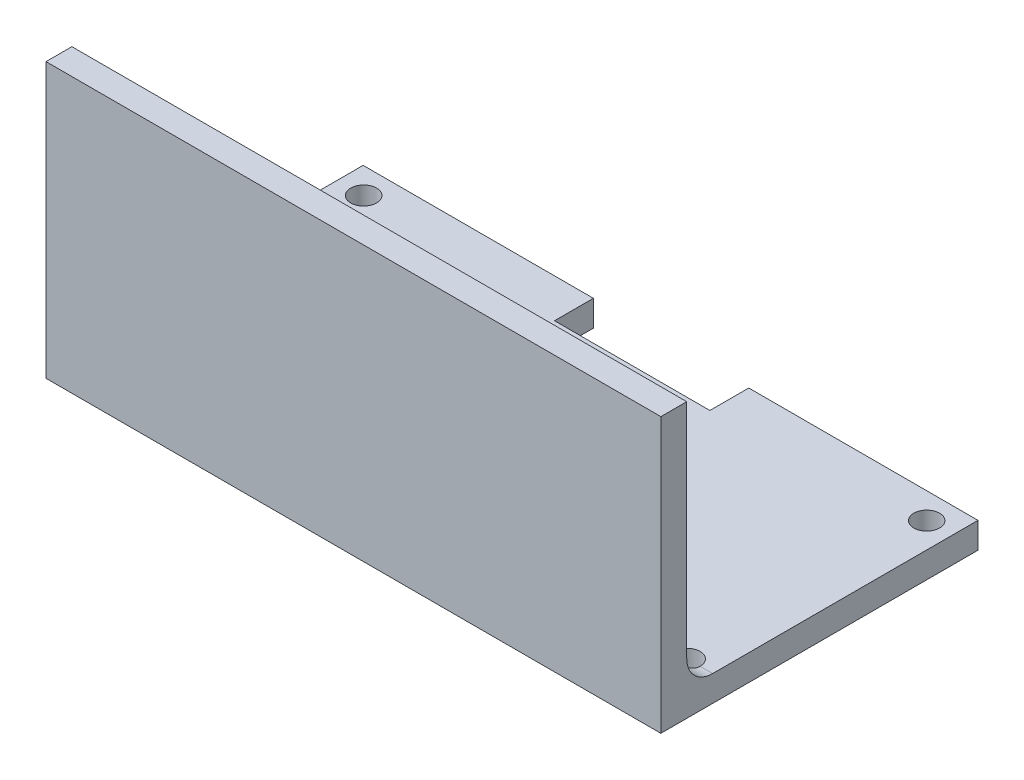
ISO-10303-21;
HEADER;
FILE_DESCRIPTION(('STEP AP214'),'2;1');
FILE_NAME('part.step','',(''),(''),'','','');
FILE_SCHEMA(('AUTOMOTIVE_DESIGN { 1 0 10303 214 1 1 1 1 }'));
ENDSEC;
DATA;
#1=APPLICATION_CONTEXT('core data for automotive mechanical design processes');
#2=APPLICATION_PROTOCOL_DEFINITION('international standard','automotive_design',2000,#1);
#3=PRODUCT_CONTEXT('',#1,'mechanical');
#4=PRODUCT('Part','Part','',(#3));
#5=PRODUCT_RELATED_PRODUCT_CATEGORY('part','',(#4));
#6=PRODUCT_DEFINITION_FORMATION('','',#4);
#7=PRODUCT_DEFINITION_CONTEXT('part definition',#1,'design');
#8=PRODUCT_DEFINITION('design','',#6,#7);
#9=PRODUCT_DEFINITION_SHAPE('','',#8);
#10=(LENGTH_UNIT() NAMED_UNIT(*) SI_UNIT(.MILLI.,.METRE.));
#11=(NAMED_UNIT(*) PLANE_ANGLE_UNIT() SI_UNIT($,.RADIAN.));
#12=(NAMED_UNIT(*) SI_UNIT($,.STERADIAN.) SOLID_ANGLE_UNIT());
#13=UNCERTAINTY_MEASURE_WITH_UNIT(LENGTH_MEASURE(1.E-05),#10,'distance_accuracy_value','');
#14=(GEOMETRIC_REPRESENTATION_CONTEXT(3) GLOBAL_UNCERTAINTY_ASSIGNED_CONTEXT((#13)) GLOBAL_UNIT_ASSIGNED_CONTEXT((#10,
#11,#12)) REPRESENTATION_CONTEXT('',''));
#15=CARTESIAN_POINT('',(0.,0.,0.));
#16=DIRECTION('',(0.,0.,1.));
#17=DIRECTION('',(1.,0.,0.));
#18=AXIS2_PLACEMENT_3D('',#15,#16,#17);
#19=CARTESIAN_POINT('',(-79.8619125241838,4.,13.7648006214418));
#20=DIRECTION('',(-1.,0.,0.));
#21=DIRECTION('',(0.,0.,1.));
#22=AXIS2_PLACEMENT_3D('',#19,#20,#21);
#23=CYLINDRICAL_SURFACE('',#22,2.);
#24=CARTESIAN_POINT('',(-78.82638927389,2.,13.7648006214418));
#25=CARTESIAN_POINT('',(-78.8263906766208,1.99999730053258,13.7912058140592));
#26=CARTESIAN_POINT('',(-78.8253427056016,2.0005235028447,13.8175969699913));
#27=CARTESIAN_POINT('',(-78.8211724394585,2.00260451764343,13.8701636253248));
#28=CARTESIAN_POINT('',(-78.8180509773506,2.00415891705531,13.8963392070586));
#29=CARTESIAN_POINT('',(-78.8056563572098,2.01029917596668,13.9740133699935));
#30=CARTESIAN_POINT('',(-78.7933523448074,2.01636274894786,14.024947526913));
#31=CARTESIAN_POINT('',(-78.7612040463394,2.03183273152503,14.1237183518671));
#32=CARTESIAN_POINT('',(-78.7413683839909,2.04123531716701,14.171558489499));
#33=CARTESIAN_POINT('',(-78.6948475994431,2.06252943652307,14.2632228012039));
#34=CARTESIAN_POINT('',(-78.6681556318775,2.07442345549281,14.307042901968));
#35=CARTESIAN_POINT('',(-78.6068703531311,2.10043809824125,14.392311623266));
#36=CARTESIAN_POINT('',(-78.5718991466863,2.11464948379914,14.433460355679));
#37=CARTESIAN_POINT('',(-78.4958635338584,2.14340181229798,14.509583460166));
#38=CARTESIAN_POINT('',(-78.4547951548608,2.15794296482571,14.5445537739106));
#39=CARTESIAN_POINT('',(-78.3639053566972,2.18701066761455,14.6100531005108));
#40=CARTESIAN_POINT('',(-78.3136519607212,2.20144847860652,14.6400266996228));
#41=CARTESIAN_POINT('',(-78.2080205989252,2.2271404855704,14.690969337651));
#42=CARTESIAN_POINT('',(-78.152646453432,2.23839702989233,14.7119450246079));
#43=CARTESIAN_POINT('',(-78.0417248386097,2.2554212269616,14.7429328811609));
#44=CARTESIAN_POINT('',(-77.9863862026021,2.26147713470105,14.7535262166481));
#45=CARTESIAN_POINT('',(-77.8744118490051,2.26818108241966,14.7652275843675));
#46=CARTESIAN_POINT('',(-77.8177774339023,2.26883433254572,14.7663447551307));
#47=CARTESIAN_POINT('',(-77.7121024438092,2.26489066751361,14.7594878564733));
#48=CARTESIAN_POINT('',(-77.6629636423443,2.26091223299037,14.7525849547301));
#49=CARTESIAN_POINT('',(-77.5666658271934,2.24923746262066,14.7317400175106));
#50=CARTESIAN_POINT('',(-77.5195073840757,2.24154006316962,14.7177959682512));
#51=CARTESIAN_POINT('',(-77.4271618435397,2.22312557536121,14.6830110395888));
#52=CARTESIAN_POINT('',(-77.3820461649969,2.21234238073419,14.6620172070066));
#53=CARTESIAN_POINT('',(-77.2957579843169,2.1889668748218,14.6138443042864));
#54=CARTESIAN_POINT('',(-77.2545875553031,2.17637362099291,14.5866620073253));
#55=CARTESIAN_POINT('',(-77.171865632664,2.14886762944909,14.5228647788188));
#56=CARTESIAN_POINT('',(-77.130927942316,2.13386327367781,14.4854907887354));
#57=CARTESIAN_POINT('',(-77.0556500953307,2.10452218677047,14.4043516332432));
#58=CARTESIAN_POINT('',(-77.0213123697157,2.09018570310504,14.360584123261));
#59=CARTESIAN_POINT('',(-76.9586957898924,2.06297676271028,14.265304333547));
#60=CARTESIAN_POINT('',(-76.9307752512297,2.05020408738087,14.213525636129));
#61=CARTESIAN_POINT('',(-76.8842828206029,2.02841649309686,14.1052419163897));
#62=CARTESIAN_POINT('',(-76.865698939806,2.01939675771243,14.0487430643793));
#63=CARTESIAN_POINT('',(-76.8399477212201,2.00677364049407,13.9376995485974));
#64=CARTESIAN_POINT('',(-76.8319437673522,2.00277481120003,13.8833974265881));
#65=CARTESIAN_POINT('',(-76.8266760283597,2.00014341769563,13.8013284802208));
#66=CARTESIAN_POINT('',(-76.8260511374659,1.99983142136346,13.7737895907992));
#67=CARTESIAN_POINT('',(-76.8270707499698,2.00034023724626,13.7187543875949));
#68=CARTESIAN_POINT('',(-76.8287160685828,2.00116145639049,13.6912580926578));
#69=CARTESIAN_POINT('',(-76.8314936218826,2.00254728256629,13.663891545454));
#70=B_SPLINE_CURVE_WITH_KNOTS('',3,(#24,#25,#26,#27,#28,#29,#30,#31,#32,#33,#34,#35,#36,#37,#38,
#39,#40,#41,#42,#43,#44,#45,#46,#47,#48,#49,#50,#51,#52,#53,#54,#55,#56,#57,#58,#59,#60,#61,#62,
#63,#64,#65,#66,#67,#68,#69),.UNSPECIFIED.,.F.,.F.,(4,2,2,2,2,2,2,2,2,2,2,2,2,2,2,2,2,2,2,2,2,2,
4),(0.,0.0791624081102156,0.158293032290819,0.315701742307837,0.47293076066649,
0.630317371509655,0.797144021461813,0.96407984830509,1.14397304071197,1.32373309047992,
1.49273163528559,1.66156718437676,1.8102131484956,1.95890164977203,2.11105047862747,
2.26327882419852,2.43481236034565,2.60640895835693,2.78602799466294,2.96541579599488,
3.12954523836756,3.21208521527715,3.29465483939361),.UNSPECIFIED.);
#71=CARTESIAN_POINT('',(-78.82638927389,2.,13.7648006214418));
#72=VERTEX_POINT('',#71);
#73=CARTESIAN_POINT('',(-76.82638927389,2.,13.7648006214418));
#74=VERTEX_POINT('',#73);
#75=EDGE_CURVE('E299',#72,#74,#70,.T.);
#76=ORIENTED_EDGE('',*,*,#75,.F.);
#77=DIRECTION('',(-1.,0.,0.));
#78=VECTOR('',#77,1.);
#79=CARTESIAN_POINT('',(0.,2.,13.7648006214418));
#80=LINE('',#79,#78);
#81=CARTESIAN_POINT('',(-79.8619125241838,2.,13.7648006214417));
#82=VERTEX_POINT('',#81);
#83=EDGE_CURVE('E288',#82,#72,#80,.F.);
#84=ORIENTED_EDGE('',*,*,#83,.F.);
#85=CARTESIAN_POINT('',(-79.8619125241838,4.,13.7648006214418));
#86=DIRECTION('',(1.,0.,0.));
#87=DIRECTION('',(0.,0.,-1.));
#88=AXIS2_PLACEMENT_3D('',#85,#86,#87);
#89=CIRCLE('',#88,2.);
#90=CARTESIAN_POINT('',(-79.8619125241838,4.,15.7648006214418));
#91=VERTEX_POINT('',#90);
#92=EDGE_CURVE('E12',#82,#91,#89,.F.);
#93=ORIENTED_EDGE('',*,*,#92,.T.);
#94=DIRECTION('',(-1.,0.,0.));
#95=VECTOR('',#94,1.);
#96=CARTESIAN_POINT('',(-79.8619125241838,4.,15.7648006214418));
#97=LINE('',#96,#95);
#98=CARTESIAN_POINT('',(-32.3619125241838,4.,15.7648006214418));
#99=VERTEX_POINT('',#98);
#100=EDGE_CURVE('E277',#99,#91,#97,.T.);
#101=ORIENTED_EDGE('',*,*,#100,.F.);
#102=CARTESIAN_POINT('',(-32.3619125241838,4.,13.7648006214418));
#103=DIRECTION('',(-1.,0.,0.));
#104=DIRECTION('',(0.,0.,1.));
#105=AXIS2_PLACEMENT_3D('',#102,#103,#104);
#106=CIRCLE('',#105,2.);
#107=CARTESIAN_POINT('',(-32.3619125241838,2.,13.7648006214417));
#108=VERTEX_POINT('',#107);
#109=EDGE_CURVE('E60',#99,#108,#106,.F.);
#110=ORIENTED_EDGE('',*,*,#109,.T.);
#111=DIRECTION('',(-1.,0.,0.));
#112=VECTOR('',#111,1.);
#113=CARTESIAN_POINT('',(0.,2.,13.7648006214418));
#114=LINE('',#113,#112);
#115=CARTESIAN_POINT('',(-33.3287681279813,2.,13.7648006214418));
#116=VERTEX_POINT('',#115);
#117=EDGE_CURVE('E281',#116,#108,#114,.F.);
#118=ORIENTED_EDGE('',*,*,#117,.F.);
#119=CARTESIAN_POINT('',(-35.3240104197987,2.,13.7648006214418));
#120=CARTESIAN_POINT('',(-35.3240196562883,1.99999731098801,13.7911498033239));
#121=CARTESIAN_POINT('',(-35.3229814832767,2.0005212847948,13.8174852985002));
#122=CARTESIAN_POINT('',(-35.3188345838743,2.00259355385925,13.8699418242963));
#123=CARTESIAN_POINT('',(-35.3157266859103,2.00414143928497,13.8960629364919));
#124=CARTESIAN_POINT('',(-35.3033779184535,2.01025614979094,13.973577257629));
#125=CARTESIAN_POINT('',(-35.2911114442099,2.01629467610362,14.0244083284571));
#126=CARTESIAN_POINT('',(-35.2590499504173,2.03170126568765,14.1229824481852));
#127=CARTESIAN_POINT('',(-35.2392634926173,2.04106554169188,14.1707289369204));
#128=CARTESIAN_POINT('',(-35.1928507936652,2.06227294834341,14.2622155907892));
#129=CARTESIAN_POINT('',(-35.1662177389438,2.07411854615575,14.3059517057298));
#130=CARTESIAN_POINT('',(-35.1050684507836,2.10002390128953,14.3910486918202));
#131=CARTESIAN_POINT('',(-35.0701761990366,2.11417367871529,14.4321113720076));
#132=CARTESIAN_POINT('',(-34.994309275873,2.14279957544208,14.5080751357615));
#133=CARTESIAN_POINT('',(-34.9533306596424,2.15727590119222,14.5429721907816));
#134=CARTESIAN_POINT('',(-34.8626549951643,2.18620623886221,14.6083208505207));
#135=CARTESIAN_POINT('',(-34.8125290060411,2.20057215336619,14.6382208578906));
#136=CARTESIAN_POINT('',(-34.7071686068573,2.22613501445059,14.6890395093967));
#137=CARTESIAN_POINT('',(-34.6519379845143,2.23733428607512,14.7099647489417));
#138=CARTESIAN_POINT('',(-34.5412957375564,2.25427493153567,14.7408847221932));
#139=CARTESIAN_POINT('',(-34.4860914932412,2.26030206089156,14.751457088464));
#140=CARTESIAN_POINT('',(-34.3743896906708,2.26697697898719,14.7631401551255));
#141=CARTESIAN_POINT('',(-34.3178934229281,2.26762991887759,14.7642599158475));
#142=CARTESIAN_POINT('',(-34.2124413586908,2.26371134228409,14.75742781465));
#143=CARTESIAN_POINT('',(-34.1633883204684,2.25975231617949,14.7505396646685));
#144=CARTESIAN_POINT('',(-34.0672576082118,2.24812981219803,14.729731405709));
#145=CARTESIAN_POINT('',(-34.0201804985535,2.24046528365539,14.7158093022589));
#146=CARTESIAN_POINT('',(-33.9280012752951,2.22212809195747,14.6810772520038));
#147=CARTESIAN_POINT('',(-33.8829700109676,2.21138996296584,14.6601154654723));
#148=CARTESIAN_POINT('',(-33.7968452945497,2.18811063201937,14.6120138356231));
#149=CARTESIAN_POINT('',(-33.7557539103798,2.17556849173604,14.5848707728985));
#150=CARTESIAN_POINT('',(-33.6732191218999,2.14818152231985,14.5211829457221));
#151=CARTESIAN_POINT('',(-33.6323858114118,2.13324585232924,14.4838839586861));
#152=CARTESIAN_POINT('',(-33.5573044250291,2.10403922414746,14.4029116010195));
#153=CARTESIAN_POINT('',(-33.5230587550126,2.08976851024188,14.3592359117518));
#154=CARTESIAN_POINT('',(-33.460622286126,2.06268762719189,14.2641709950128));
#155=CARTESIAN_POINT('',(-33.4327874891417,2.04997635172959,14.2125173667377));
#156=CARTESIAN_POINT('',(-33.3864426364069,2.02829281139565,14.1045019728133));
#157=CARTESIAN_POINT('',(-33.3679206944024,2.01931578294281,14.0481463162162));
#158=CARTESIAN_POINT('',(-33.3422560436927,2.00674818239498,13.9373691669836));
#159=CARTESIAN_POINT('',(-33.3342823383118,2.00276575427113,13.8831882008116));
#160=CARTESIAN_POINT('',(-33.3290455765029,2.00014384911874,13.8013048044284));
#161=CARTESIAN_POINT('',(-33.3284285866999,1.99983246297584,13.7738288545231));
#162=CARTESIAN_POINT('',(-33.3294590045538,2.00033730332387,13.7189199392845));
#163=CARTESIAN_POINT('',(-33.3311072221108,2.00115393312511,13.691486992838));
#164=CARTESIAN_POINT('',(-33.3338851581858,2.00253254766109,13.6641836405354));
#165=B_SPLINE_CURVE_WITH_KNOTS('',3,(#119,#120,#121,#122,#123,#124,#125,#126,#127,#128,#129,
#130,#131,#132,#133,#134,#135,#136,#137,#138,#139,#140,#141,#142,#143,#144,#145,#146,#147,#148,
#149,#150,#151,#152,#153,#154,#155,#156,#157,#158,#159,#160,#161,#162,#163,#164),.UNSPECIFIED.,
.F.,.F.,(4,2,2,2,2,2,2,2,2,2,2,2,2,2,2,2,2,2,2,2,2,2,4),(0.,0.0789945175294009,
0.157957435746329,0.31503451922661,0.471933298431202,0.628988828113019,0.795431100601996,
0.96198172552628,1.1413973018828,1.32068080183299,1.48926828819443,1.65769416492153,
1.80607648672024,1.95450090584395,2.10635772075132,2.25829380918555,2.429405434441,
2.60057943337982,2.7797204820243,2.95863230388982,3.12238912881203,3.20474011546546,
3.28712055347572),.UNSPECIFIED.);
#166=CARTESIAN_POINT('',(-35.3240104197987,2.,13.7648006214418));
#167=VERTEX_POINT('',#166);
#168=EDGE_CURVE('E67',#167,#116,#165,.T.);
#169=ORIENTED_EDGE('',*,*,#168,.F.);
#170=DIRECTION('',(-1.,0.,0.));
#171=VECTOR('',#170,1.);
#172=CARTESIAN_POINT('',(0.,2.,13.7648006214418));
#173=LINE('',#172,#171);
#174=EDGE_CURVE('E285',#74,#167,#173,.F.);
#175=ORIENTED_EDGE('',*,*,#174,.F.);
#176=EDGE_LOOP('',(#76,#84,#93,#101,#110,#118,#169,#175));
#177=FACE_BOUND('',#176,.T.);
#178=ADVANCED_FACE('F51',(#177),#23,.F.);
#179=CARTESIAN_POINT('',(-79.8619125241838,2.,-6.73519937855824));
#180=DIRECTION('',(0.,0.,1.));
#181=DIRECTION('',(1.,0.,0.));
#182=AXIS2_PLACEMENT_3D('',#179,#180,#181);
#183=PLANE('',#182);
#184=DIRECTION('',(0.,1.,0.));
#185=VECTOR('',#184,1.);
#186=CARTESIAN_POINT('',(-50.0697466994081,-8.,-6.73519937855824));
#187=LINE('',#186,#185);
#188=CARTESIAN_POINT('',(-50.0697466994081,0.,-6.73519937855824));
#189=VERTEX_POINT('',#188);
#190=CARTESIAN_POINT('',(-50.0697466994081,2.,-6.73519937855824));
#191=VERTEX_POINT('',#190);
#192=EDGE_CURVE('E201',#189,#191,#187,.T.);
#193=ORIENTED_EDGE('',*,*,#192,.T.);
#194=DIRECTION('',(-1.,0.,0.));
#195=VECTOR('',#194,1.);
#196=CARTESIAN_POINT('',(-79.8619125241838,2.,-6.73519937855824));
#197=LINE('',#196,#195);
#198=CARTESIAN_POINT('',(-32.3619125241838,2.,-6.73519937855824));
#199=VERTEX_POINT('',#198);
#200=EDGE_CURVE('E246',#199,#191,#197,.T.);
#201=ORIENTED_EDGE('',*,*,#200,.F.);
#202=DIRECTION('',(0.,-1.,0.));
#203=VECTOR('',#202,1.);
#204=CARTESIAN_POINT('',(-32.3619125241838,2.,-6.73519937855824));
#205=LINE('',#204,#203);
#206=CARTESIAN_POINT('',(-32.3619125241838,0.,-6.73519937855824));
#207=VERTEX_POINT('',#206);
#208=EDGE_CURVE('E262',#199,#207,#205,.T.);
#209=ORIENTED_EDGE('',*,*,#208,.T.);
#210=DIRECTION('',(-1.,0.,0.));
#211=VECTOR('',#210,1.);
#212=CARTESIAN_POINT('',(-79.8619125241838,0.,-6.73519937855824));
#213=LINE('',#212,#211);
#214=EDGE_CURVE('E242',#207,#189,#213,.T.);
#215=ORIENTED_EDGE('',*,*,#214,.T.);
#216=EDGE_LOOP('',(#193,#201,#209,#215));
#217=FACE_BOUND('',#216,.T.);
#218=ADVANCED_FACE('F325',(#217),#183,.F.);
#219=CARTESIAN_POINT('',(-79.8619125241838,2.,-6.73519937855824));
#220=DIRECTION('',(1.,0.,0.));
#221=DIRECTION('',(0.,0.,-1.));
#222=AXIS2_PLACEMENT_3D('',#219,#220,#221);
#223=PLANE('',#222);
#224=DIRECTION('',(0.,0.,1.));
#225=VECTOR('',#224,1.);
#226=CARTESIAN_POINT('',(-79.8619125241838,0.,-6.73519937855824));
#227=LINE('',#226,#225);
#228=CARTESIAN_POINT('',(-79.8619125241838,0.,-6.73519937855824));
#229=VERTEX_POINT('',#228);
#230=CARTESIAN_POINT('',(-79.8619125241838,0.,17.7648006214418));
#231=VERTEX_POINT('',#230);
#232=EDGE_CURVE('E172',#229,#231,#227,.T.);
#233=ORIENTED_EDGE('',*,*,#232,.T.);
#234=DIRECTION('',(0.,-1.,0.));
#235=VECTOR('',#234,1.);
#236=CARTESIAN_POINT('',(-79.8619125241838,21.1900753357362,17.7648006214418));
#237=LINE('',#236,#235);
#238=CARTESIAN_POINT('',(-79.8619125241838,21.1900753357362,17.7648006214418));
#239=VERTEX_POINT('',#238);
#240=EDGE_CURVE('E150',#239,#231,#237,.T.);
#241=ORIENTED_EDGE('',*,*,#240,.F.);
#242=DIRECTION('',(0.,0.,1.));
#243=VECTOR('',#242,1.);
#244=CARTESIAN_POINT('',(-79.8619125241838,21.1900753357362,15.7648006214418));
#245=LINE('',#244,#243);
#246=CARTESIAN_POINT('',(-79.8619125241838,21.1900753357362,15.7648006214418));
#247=VERTEX_POINT('',#246);
#248=EDGE_CURVE('E157',#247,#239,#245,.T.);
#249=ORIENTED_EDGE('',*,*,#248,.F.);
#250=DIRECTION('',(0.,-1.,0.));
#251=VECTOR('',#250,1.);
#252=CARTESIAN_POINT('',(-79.8619125241838,21.1900753357362,15.7648006214418));
#253=LINE('',#252,#251);
#254=EDGE_CURVE('E381',#247,#91,#253,.T.);
#255=ORIENTED_EDGE('',*,*,#254,.T.);
#256=ORIENTED_EDGE('',*,*,#92,.F.);
#257=DIRECTION('',(0.,0.,1.));
#258=VECTOR('',#257,1.);
#259=CARTESIAN_POINT('',(-79.8619125241838,2.,-6.73519937855824));
#260=LINE('',#259,#258);
#261=CARTESIAN_POINT('',(-79.8619125241838,2.,-6.73519937855824));
#262=VERTEX_POINT('',#261);
#263=EDGE_CURVE('E237',#262,#82,#260,.T.);
#264=ORIENTED_EDGE('',*,*,#263,.F.);
#265=DIRECTION('',(0.,-1.,0.));
#266=VECTOR('',#265,1.);
#267=CARTESIAN_POINT('',(-79.8619125241838,2.,-6.73519937855824));
#268=LINE('',#267,#266);
#269=EDGE_CURVE('E250',#262,#229,#268,.T.);
#270=ORIENTED_EDGE('',*,*,#269,.T.);
#271=EDGE_LOOP('',(#233,#241,#249,#255,#256,#264,#270));
#272=FACE_BOUND('',#271,.T.);
#273=ADVANCED_FACE('F169',(#272),#223,.F.);
#274=CARTESIAN_POINT('',(-32.3619125241838,2.,-6.73519937855824));
#275=DIRECTION('',(-1.,0.,0.));
#276=DIRECTION('',(0.,0.,1.));
#277=AXIS2_PLACEMENT_3D('',#274,#275,#276);
#278=PLANE('',#277);
#279=DIRECTION('',(0.,0.,-1.));
#280=VECTOR('',#279,1.);
#281=CARTESIAN_POINT('',(-32.3619125241838,0.,-6.73519937855824));
#282=LINE('',#281,#280);
#283=CARTESIAN_POINT('',(-32.3619125241838,0.,17.7648006214418));
#284=VERTEX_POINT('',#283);
#285=EDGE_CURVE('E253',#284,#207,#282,.T.);
#286=ORIENTED_EDGE('',*,*,#285,.T.);
#287=ORIENTED_EDGE('',*,*,#208,.F.);
#288=DIRECTION('',(0.,0.,-1.));
#289=VECTOR('',#288,1.);
#290=CARTESIAN_POINT('',(-32.3619125241838,2.,-6.73519937855824));
#291=LINE('',#290,#289);
#292=EDGE_CURVE('E241',#108,#199,#291,.T.);
#293=ORIENTED_EDGE('',*,*,#292,.F.);
#294=ORIENTED_EDGE('',*,*,#109,.F.);
#295=DIRECTION('',(0.,-1.,0.));
#296=VECTOR('',#295,1.);
#297=CARTESIAN_POINT('',(-32.3619125241838,21.1900753357362,15.7648006214418));
#298=LINE('',#297,#296);
#299=CARTESIAN_POINT('',(-32.3619125241838,21.1900753357362,15.7648006214418));
#300=VERTEX_POINT('',#299);
#301=EDGE_CURVE('E182',#300,#99,#298,.T.);
#302=ORIENTED_EDGE('',*,*,#301,.F.);
#303=DIRECTION('',(0.,0.,-1.));
#304=VECTOR('',#303,1.);
#305=CARTESIAN_POINT('',(-32.3619125241838,21.1900753357362,15.7648006214418));
#306=LINE('',#305,#304);
#307=CARTESIAN_POINT('',(-32.3619125241838,21.1900753357362,17.7648006214418));
#308=VERTEX_POINT('',#307);
#309=EDGE_CURVE('E156',#308,#300,#306,.T.);
#310=ORIENTED_EDGE('',*,*,#309,.F.);
#311=DIRECTION('',(0.,-1.,0.));
#312=VECTOR('',#311,1.);
#313=CARTESIAN_POINT('',(-32.3619125241838,21.1900753357362,17.7648006214418));
#314=LINE('',#313,#312);
#315=EDGE_CURVE('E152',#308,#284,#314,.T.);
#316=ORIENTED_EDGE('',*,*,#315,.T.);
#317=EDGE_LOOP('',(#286,#287,#293,#294,#302,#310,#316));
#318=FACE_BOUND('',#317,.T.);
#319=ADVANCED_FACE('F323',(#318),#278,.F.);
#320=CARTESIAN_POINT('',(-62.0739323200493,2.,-6.73519937855824));
#321=VERTEX_POINT('',#320);
#322=EDGE_CURVE('E245',#321,#262,#197,.T.);
#323=ORIENTED_EDGE('',*,*,#322,.F.);
#324=DIRECTION('',(0.,1.,0.));
#325=VECTOR('',#324,1.);
#326=CARTESIAN_POINT('',(-62.0739323200493,-8.,-6.73519937855824));
#327=LINE('',#326,#325);
#328=CARTESIAN_POINT('',(-62.0739323200493,0.,-6.73519937855824));
#329=VERTEX_POINT('',#328);
#330=EDGE_CURVE('E198',#329,#321,#327,.T.);
#331=ORIENTED_EDGE('',*,*,#330,.F.);
#332=EDGE_CURVE('E256',#329,#229,#213,.T.);
#333=ORIENTED_EDGE('',*,*,#332,.T.);
#334=ORIENTED_EDGE('',*,*,#269,.F.);
#335=EDGE_LOOP('',(#323,#331,#333,#334));
#336=FACE_BOUND('',#335,.T.);
#337=ADVANCED_FACE('F316',(#336),#183,.F.);
#338=CARTESIAN_POINT('',(0.,2.,0.));
#339=DIRECTION('',(0.,1.,0.));
#340=DIRECTION('',(0.,0.,1.));
#341=AXIS2_PLACEMENT_3D('',#338,#339,#340);
#342=PLANE('',#341);
#343=ORIENTED_EDGE('',*,*,#263,.T.);
#344=ORIENTED_EDGE('',*,*,#83,.T.);
#345=CARTESIAN_POINT('',(-77.82638927389,2.,13.7648006214418));
#346=DIRECTION('',(0.,1.,0.));
#347=DIRECTION('',(0.,0.,1.));
#348=AXIS2_PLACEMENT_3D('',#345,#346,#347);
#349=CIRCLE('',#348,0.999999999999998);
#350=EDGE_CURVE('E210',#74,#72,#349,.T.);
#351=ORIENTED_EDGE('',*,*,#350,.F.);
#352=ORIENTED_EDGE('',*,*,#174,.T.);
#353=CARTESIAN_POINT('',(-34.32638927389,2.,13.7650975605227));
#354=DIRECTION('',(0.,1.,0.));
#355=DIRECTION('',(0.,0.,1.));
#356=AXIS2_PLACEMENT_3D('',#353,#354,#355);
#357=CIRCLE('',#356,0.997621190100215);
#358=EDGE_CURVE('E234',#116,#167,#357,.T.);
#359=ORIENTED_EDGE('',*,*,#358,.F.);
#360=ORIENTED_EDGE('',*,*,#117,.T.);
#361=ORIENTED_EDGE('',*,*,#292,.T.);
#362=ORIENTED_EDGE('',*,*,#200,.T.);
#363=DIRECTION('',(0.,0.,1.));
#364=VECTOR('',#363,1.);
#365=CARTESIAN_POINT('',(-50.0697466994081,2.,-6.73519937855824));
#366=LINE('',#365,#364);
#367=CARTESIAN_POINT('',(-50.0697466994081,2.,-3.73031583067593));
#368=VERTEX_POINT('',#367);
#369=EDGE_CURVE('E180',#191,#368,#366,.T.);
#370=ORIENTED_EDGE('',*,*,#369,.T.);
#371=DIRECTION('',(1.,0.,0.));
#372=VECTOR('',#371,1.);
#373=CARTESIAN_POINT('',(-62.0739323200493,2.,-3.73031583067593));
#374=LINE('',#373,#372);
#375=CARTESIAN_POINT('',(-62.0739323200493,2.,-3.73031583067593));
#376=VERTEX_POINT('',#375);
#377=EDGE_CURVE('E175',#376,#368,#374,.T.);
#378=ORIENTED_EDGE('',*,*,#377,.F.);
#379=DIRECTION('',(0.,0.,1.));
#380=VECTOR('',#379,1.);
#381=CARTESIAN_POINT('',(-62.0739323200493,2.,-6.73519937855824));
#382=LINE('',#381,#380);
#383=EDGE_CURVE('E189',#321,#376,#382,.T.);
#384=ORIENTED_EDGE('',*,*,#383,.F.);
#385=ORIENTED_EDGE('',*,*,#322,.T.);
#386=EDGE_LOOP('',(#343,#344,#351,#352,#359,#360,#361,#362,#370,#378,#384,#385));
#387=FACE_BOUND('',#386,.T.);
#388=CARTESIAN_POINT('',(-77.8239323200494,2.,-4.73519937855824));
#389=DIRECTION('',(0.,1.,0.));
#390=DIRECTION('',(0.,0.,1.));
#391=AXIS2_PLACEMENT_3D('',#388,#389,#390);
#392=CIRCLE('',#391,0.999999999999998);
#393=CARTESIAN_POINT('',(-77.8239323200494,2.,-3.73519937855825));
#394=VERTEX_POINT('',#393);
#395=EDGE_CURVE('E218',#394,#394,#392,.T.);
#396=ORIENTED_EDGE('',*,*,#395,.F.);
#397=EDGE_LOOP('',(#396));
#398=FACE_BOUND('',#397,.T.);
#399=CARTESIAN_POINT('',(-34.3245158367701,2.,-4.73538954817592));
#400=DIRECTION('',(0.,1.,0.));
#401=DIRECTION('',(0.,0.,1.));
#402=AXIS2_PLACEMENT_3D('',#399,#400,#401);
#403=CIRCLE('',#402,0.995230862637965);
#404=CARTESIAN_POINT('',(-34.3245158367701,2.,-3.74015868553795));
#405=VERTEX_POINT('',#404);
#406=EDGE_CURVE('E226',#405,#405,#403,.T.);
#407=ORIENTED_EDGE('',*,*,#406,.F.);
#408=EDGE_LOOP('',(#407));
#409=FACE_BOUND('',#408,.T.);
#410=ADVANCED_FACE('F313',(#387,#398,#409),#342,.T.);
#411=CARTESIAN_POINT('',(0.,0.,0.));
#412=DIRECTION('',(0.,1.,0.));
#413=DIRECTION('',(0.,0.,1.));
#414=AXIS2_PLACEMENT_3D('',#411,#412,#413);
#415=PLANE('',#414);
#416=CARTESIAN_POINT('',(-77.82638927389,0.,13.7648006214418));
#417=DIRECTION('',(0.,-1.,0.));
#418=DIRECTION('',(0.,0.,-1.));
#419=AXIS2_PLACEMENT_3D('',#416,#417,#418);
#420=CIRCLE('',#419,0.999999999999998);
#421=CARTESIAN_POINT('',(-77.82638927389,0.,12.7648006214418));
#422=VERTEX_POINT('',#421);
#423=EDGE_CURVE('E197',#422,#422,#420,.T.);
#424=ORIENTED_EDGE('',*,*,#423,.F.);
#425=EDGE_LOOP('',(#424));
#426=FACE_BOUND('',#425,.T.);
#427=CARTESIAN_POINT('',(-77.8239323200494,0.,-4.73519937855824));
#428=DIRECTION('',(0.,-1.,0.));
#429=DIRECTION('',(0.,0.,-1.));
#430=AXIS2_PLACEMENT_3D('',#427,#428,#429);
#431=CIRCLE('',#430,0.999999999999998);
#432=CARTESIAN_POINT('',(-77.8239323200494,0.,-5.73519937855824));
#433=VERTEX_POINT('',#432);
#434=EDGE_CURVE('E214',#433,#433,#431,.T.);
#435=ORIENTED_EDGE('',*,*,#434,.F.);
#436=EDGE_LOOP('',(#435));
#437=FACE_BOUND('',#436,.T.);
#438=CARTESIAN_POINT('',(-34.3245158367701,0.,-4.73538954817592));
#439=DIRECTION('',(0.,-1.,0.));
#440=DIRECTION('',(0.,0.,-1.));
#441=AXIS2_PLACEMENT_3D('',#438,#439,#440);
#442=CIRCLE('',#441,0.995230862637965);
#443=CARTESIAN_POINT('',(-34.3245158367701,0.,-5.73062041081388));
#444=VERTEX_POINT('',#443);
#445=EDGE_CURVE('E222',#444,#444,#442,.T.);
#446=ORIENTED_EDGE('',*,*,#445,.F.);
#447=EDGE_LOOP('',(#446));
#448=FACE_BOUND('',#447,.T.);
#449=CARTESIAN_POINT('',(-34.32638927389,0.,13.7650975605227));
#450=DIRECTION('',(0.,-1.,0.));
#451=DIRECTION('',(0.,0.,-1.));
#452=AXIS2_PLACEMENT_3D('',#449,#450,#451);
#453=CIRCLE('',#452,0.997621190100215);
#454=CARTESIAN_POINT('',(-34.32638927389,0.,12.7674763704225));
#455=VERTEX_POINT('',#454);
#456=EDGE_CURVE('E230',#455,#455,#453,.T.);
#457=ORIENTED_EDGE('',*,*,#456,.F.);
#458=EDGE_LOOP('',(#457));
#459=FACE_BOUND('',#458,.T.);
#460=ORIENTED_EDGE('',*,*,#332,.F.);
#461=DIRECTION('',(0.,0.,1.));
#462=VECTOR('',#461,1.);
#463=CARTESIAN_POINT('',(-62.0739323200493,0.,0.));
#464=LINE('',#463,#462);
#465=CARTESIAN_POINT('',(-62.0739323200493,0.,-3.73031583067593));
#466=VERTEX_POINT('',#465);
#467=EDGE_CURVE('E273',#329,#466,#464,.T.);
#468=ORIENTED_EDGE('',*,*,#467,.T.);
#469=DIRECTION('',(1.,0.,0.));
#470=VECTOR('',#469,1.);
#471=CARTESIAN_POINT('',(0.,0.,-3.73031583067593));
#472=LINE('',#471,#470);
#473=CARTESIAN_POINT('',(-50.0697466994081,0.,-3.73031583067593));
#474=VERTEX_POINT('',#473);
#475=EDGE_CURVE('E269',#466,#474,#472,.T.);
#476=ORIENTED_EDGE('',*,*,#475,.T.);
#477=DIRECTION('',(0.,0.,1.));
#478=VECTOR('',#477,1.);
#479=CARTESIAN_POINT('',(-50.0697466994081,0.,0.));
#480=LINE('',#479,#478);
#481=EDGE_CURVE('E266',#189,#474,#480,.T.);
#482=ORIENTED_EDGE('',*,*,#481,.F.);
#483=ORIENTED_EDGE('',*,*,#214,.F.);
#484=ORIENTED_EDGE('',*,*,#285,.F.);
#485=DIRECTION('',(1.,0.,0.));
#486=VECTOR('',#485,1.);
#487=CARTESIAN_POINT('',(-79.8619125241838,0.,17.7648006214418));
#488=LINE('',#487,#486);
#489=EDGE_CURVE('E167',#231,#284,#488,.T.);
#490=ORIENTED_EDGE('',*,*,#489,.F.);
#491=ORIENTED_EDGE('',*,*,#232,.F.);
#492=EDGE_LOOP('',(#460,#468,#476,#482,#483,#484,#490,#491));
#493=FACE_BOUND('',#492,.T.);
#494=ADVANCED_FACE('F311',(#426,#437,#448,#459,#493),#415,.F.);
#495=CARTESIAN_POINT('',(-34.32638927389,10.,13.7650975605227));
#496=DIRECTION('',(0.,-1.,0.));
#497=DIRECTION('',(0.,0.,-1.));
#498=AXIS2_PLACEMENT_3D('',#495,#496,#497);
#499=CYLINDRICAL_SURFACE('',#498,0.997621190100215);
#500=ORIENTED_EDGE('',*,*,#358,.T.);
#501=ORIENTED_EDGE('',*,*,#168,.T.);
#502=EDGE_LOOP('',(#500,#501));
#503=FACE_BOUND('',#502,.T.);
#504=ORIENTED_EDGE('',*,*,#456,.T.);
#505=EDGE_LOOP('',(#504));
#506=FACE_BOUND('',#505,.T.);
#507=ADVANCED_FACE('F305',(#503,#506),#499,.F.);
#508=CARTESIAN_POINT('',(-34.3245158367701,10.,-4.73538954817592));
#509=DIRECTION('',(0.,-1.,0.));
#510=DIRECTION('',(0.,0.,-1.));
#511=AXIS2_PLACEMENT_3D('',#508,#509,#510);
#512=CYLINDRICAL_SURFACE('',#511,0.995230862637965);
#513=ORIENTED_EDGE('',*,*,#406,.T.);
#514=EDGE_LOOP('',(#513));
#515=FACE_BOUND('',#514,.T.);
#516=ORIENTED_EDGE('',*,*,#445,.T.);
#517=EDGE_LOOP('',(#516));
#518=FACE_BOUND('',#517,.T.);
#519=ADVANCED_FACE('F310',(#515,#518),#512,.F.);
#520=CARTESIAN_POINT('',(-77.8239323200494,10.,-4.73519937855824));
#521=DIRECTION('',(0.,-1.,0.));
#522=DIRECTION('',(0.,0.,-1.));
#523=AXIS2_PLACEMENT_3D('',#520,#521,#522);
#524=CYLINDRICAL_SURFACE('',#523,0.999999999999998);
#525=ORIENTED_EDGE('',*,*,#395,.T.);
#526=EDGE_LOOP('',(#525));
#527=FACE_BOUND('',#526,.T.);
#528=ORIENTED_EDGE('',*,*,#434,.T.);
#529=EDGE_LOOP('',(#528));
#530=FACE_BOUND('',#529,.T.);
#531=ADVANCED_FACE('F347',(#527,#530),#524,.F.);
#532=CARTESIAN_POINT('',(-77.82638927389,10.,13.7648006214418));
#533=DIRECTION('',(0.,-1.,0.));
#534=DIRECTION('',(0.,0.,-1.));
#535=AXIS2_PLACEMENT_3D('',#532,#533,#534);
#536=CYLINDRICAL_SURFACE('',#535,0.999999999999998);
#537=ORIENTED_EDGE('',*,*,#350,.T.);
#538=ORIENTED_EDGE('',*,*,#75,.T.);
#539=EDGE_LOOP('',(#537,#538));
#540=FACE_BOUND('',#539,.T.);
#541=ORIENTED_EDGE('',*,*,#423,.T.);
#542=EDGE_LOOP('',(#541));
#543=FACE_BOUND('',#542,.T.);
#544=ADVANCED_FACE('F343',(#540,#543),#536,.F.);
#545=CARTESIAN_POINT('',(-62.0739323200493,-8.,-3.73031583067593));
#546=DIRECTION('',(0.,0.,1.));
#547=DIRECTION('',(1.,0.,0.));
#548=AXIS2_PLACEMENT_3D('',#545,#546,#547);
#549=PLANE('',#548);
#550=DIRECTION('',(0.,1.,0.));
#551=VECTOR('',#550,1.);
#552=CARTESIAN_POINT('',(-62.0739323200493,-8.,-3.73031583067593));
#553=LINE('',#552,#551);
#554=EDGE_CURVE('E194',#466,#376,#553,.T.);
#555=ORIENTED_EDGE('',*,*,#554,.T.);
#556=ORIENTED_EDGE('',*,*,#377,.T.);
#557=DIRECTION('',(0.,1.,0.));
#558=VECTOR('',#557,1.);
#559=CARTESIAN_POINT('',(-50.0697466994081,-8.,-3.73031583067593));
#560=LINE('',#559,#558);
#561=EDGE_CURVE('E193',#474,#368,#560,.T.);
#562=ORIENTED_EDGE('',*,*,#561,.F.);
#563=ORIENTED_EDGE('',*,*,#475,.F.);
#564=EDGE_LOOP('',(#555,#556,#562,#563));
#565=FACE_BOUND('',#564,.T.);
#566=ADVANCED_FACE('F346',(#565),#549,.F.);
#567=CARTESIAN_POINT('',(-62.0739323200493,-8.,-6.73519937855824));
#568=DIRECTION('',(-1.,0.,0.));
#569=DIRECTION('',(0.,0.,1.));
#570=AXIS2_PLACEMENT_3D('',#567,#568,#569);
#571=PLANE('',#570);
#572=ORIENTED_EDGE('',*,*,#330,.T.);
#573=ORIENTED_EDGE('',*,*,#383,.T.);
#574=ORIENTED_EDGE('',*,*,#554,.F.);
#575=ORIENTED_EDGE('',*,*,#467,.F.);
#576=EDGE_LOOP('',(#572,#573,#574,#575));
#577=FACE_BOUND('',#576,.T.);
#578=ADVANCED_FACE('F379',(#577),#571,.F.);
#579=CARTESIAN_POINT('',(-50.0697466994081,-8.,-6.73519937855824));
#580=DIRECTION('',(-1.,0.,0.));
#581=DIRECTION('',(0.,0.,1.));
#582=AXIS2_PLACEMENT_3D('',#579,#580,#581);
#583=PLANE('',#582);
#584=ORIENTED_EDGE('',*,*,#481,.T.);
#585=ORIENTED_EDGE('',*,*,#561,.T.);
#586=ORIENTED_EDGE('',*,*,#369,.F.);
#587=ORIENTED_EDGE('',*,*,#192,.F.);
#588=EDGE_LOOP('',(#584,#585,#586,#587));
#589=FACE_BOUND('',#588,.T.);
#590=ADVANCED_FACE('F373',(#589),#583,.T.);
#591=CARTESIAN_POINT('',(-79.8619125241838,21.1900753357362,17.7648006214418));
#592=DIRECTION('',(0.,0.,-1.));
#593=DIRECTION('',(-1.,0.,0.));
#594=AXIS2_PLACEMENT_3D('',#591,#592,#593);
#595=PLANE('',#594);
#596=ORIENTED_EDGE('',*,*,#489,.T.);
#597=ORIENTED_EDGE('',*,*,#315,.F.);
#598=DIRECTION('',(1.,0.,0.));
#599=VECTOR('',#598,1.);
#600=CARTESIAN_POINT('',(-79.8619125241838,21.1900753357362,17.7648006214418));
#601=LINE('',#600,#599);
#602=EDGE_CURVE('E145',#239,#308,#601,.T.);
#603=ORIENTED_EDGE('',*,*,#602,.F.);
#604=ORIENTED_EDGE('',*,*,#240,.T.);
#605=EDGE_LOOP('',(#596,#597,#603,#604));
#606=FACE_BOUND('',#605,.T.);
#607=ADVANCED_FACE('F148',(#606),#595,.F.);
#608=CARTESIAN_POINT('',(-79.8619125241838,21.1900753357362,15.7648006214418));
#609=DIRECTION('',(0.,0.,1.));
#610=DIRECTION('',(1.,0.,0.));
#611=AXIS2_PLACEMENT_3D('',#608,#609,#610);
#612=PLANE('',#611);
#613=ORIENTED_EDGE('',*,*,#301,.T.);
#614=ORIENTED_EDGE('',*,*,#100,.T.);
#615=ORIENTED_EDGE('',*,*,#254,.F.);
#616=DIRECTION('',(-1.,0.,0.));
#617=VECTOR('',#616,1.);
#618=CARTESIAN_POINT('',(-79.8619125241838,21.1900753357362,15.7648006214418));
#619=LINE('',#618,#617);
#620=EDGE_CURVE('E162',#300,#247,#619,.T.);
#621=ORIENTED_EDGE('',*,*,#620,.F.);
#622=EDGE_LOOP('',(#613,#614,#615,#621));
#623=FACE_BOUND('',#622,.T.);
#624=ADVANCED_FACE('F383',(#623),#612,.F.);
#625=CARTESIAN_POINT('',(0.,21.1900753357362,0.));
#626=DIRECTION('',(0.,1.,0.));
#627=DIRECTION('',(0.,0.,1.));
#628=AXIS2_PLACEMENT_3D('',#625,#626,#627);
#629=PLANE('',#628);
#630=ORIENTED_EDGE('',*,*,#248,.T.);
#631=ORIENTED_EDGE('',*,*,#602,.T.);
#632=ORIENTED_EDGE('',*,*,#309,.T.);
#633=ORIENTED_EDGE('',*,*,#620,.T.);
#634=EDGE_LOOP('',(#630,#631,#632,#633));
#635=FACE_BOUND('',#634,.T.);
#636=ADVANCED_FACE('F160',(#635),#629,.T.);
#637=CLOSED_SHELL('',(#178,#218,#273,#319,#337,#410,#494,#507,#519,#531,#544,#566,#578,#590,
#607,#624,#636));
#638=MANIFOLD_SOLID_BREP('B2',#637);
#639=ADVANCED_BREP_SHAPE_REPRESENTATION('',(#18,#638),#14);
#640=SHAPE_DEFINITION_REPRESENTATION(#9,#639);
ENDSEC;
END-ISO-10303-21;
